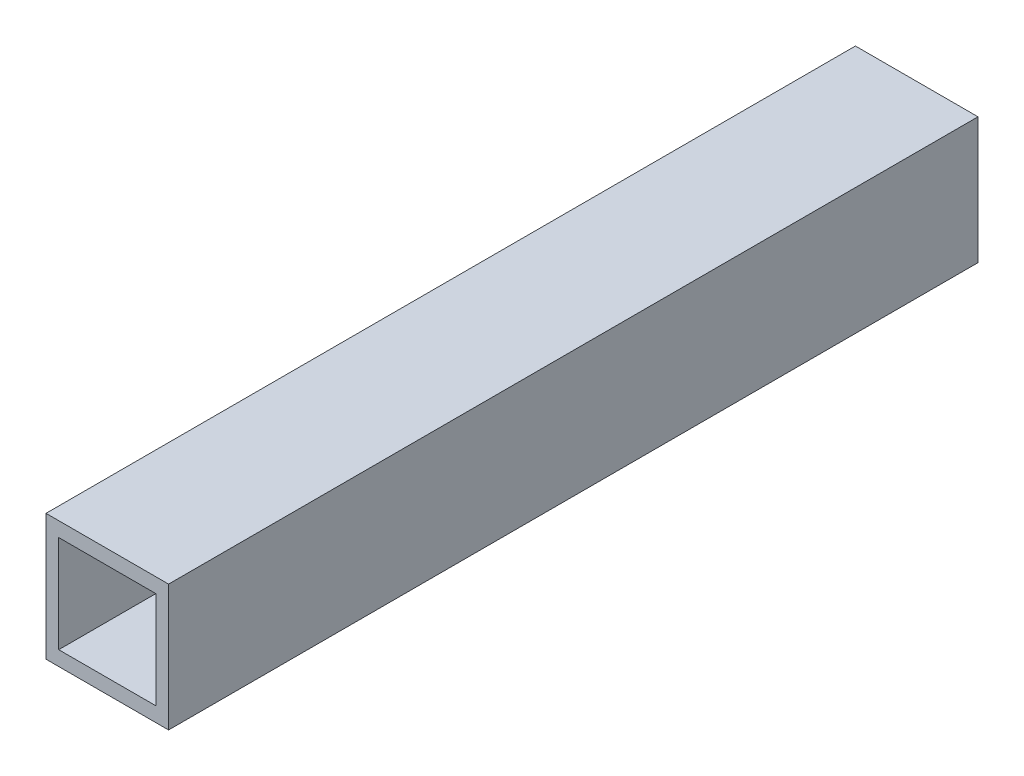
ISO-10303-21;
HEADER;
FILE_DESCRIPTION(('STEP AP214'),'2;1');
FILE_NAME('part.step','',(''),(''),'','','');
FILE_SCHEMA(('AUTOMOTIVE_DESIGN { 1 0 10303 214 1 1 1 1 }'));
ENDSEC;
DATA;
#1=APPLICATION_CONTEXT('core data for automotive mechanical design processes');
#2=APPLICATION_PROTOCOL_DEFINITION('international standard','automotive_design',2000,#1);
#3=PRODUCT_CONTEXT('',#1,'mechanical');
#4=PRODUCT('Part','Part','',(#3));
#5=PRODUCT_RELATED_PRODUCT_CATEGORY('part','',(#4));
#6=PRODUCT_DEFINITION_FORMATION('','',#4);
#7=PRODUCT_DEFINITION_CONTEXT('part definition',#1,'design');
#8=PRODUCT_DEFINITION('design','',#6,#7);
#9=PRODUCT_DEFINITION_SHAPE('','',#8);
#10=(LENGTH_UNIT() NAMED_UNIT(*) SI_UNIT(.MILLI.,.METRE.));
#11=(NAMED_UNIT(*) PLANE_ANGLE_UNIT() SI_UNIT($,.RADIAN.));
#12=(NAMED_UNIT(*) SI_UNIT($,.STERADIAN.) SOLID_ANGLE_UNIT());
#13=UNCERTAINTY_MEASURE_WITH_UNIT(LENGTH_MEASURE(1.E-05),#10,'distance_accuracy_value','');
#14=(GEOMETRIC_REPRESENTATION_CONTEXT(3) GLOBAL_UNCERTAINTY_ASSIGNED_CONTEXT((#13)) GLOBAL_UNIT_ASSIGNED_CONTEXT((#10,
#11,#12)) REPRESENTATION_CONTEXT('',''));
#15=CARTESIAN_POINT('',(0.,0.,0.));
#16=DIRECTION('',(0.,0.,1.));
#17=DIRECTION('',(1.,0.,0.));
#18=AXIS2_PLACEMENT_3D('',#15,#16,#17);
#19=CARTESIAN_POINT('',(0.,0.,63.5));
#20=DIRECTION('',(0.,0.,1.));
#21=DIRECTION('',(1.,0.,0.));
#22=AXIS2_PLACEMENT_3D('',#19,#20,#21);
#23=PLANE('',#22);
#24=DIRECTION('',(0.,1.,0.));
#25=VECTOR('',#24,1.);
#26=CARTESIAN_POINT('',(4.80846777573421,4.95609753272005,63.5));
#27=LINE('',#26,#25);
#28=CARTESIAN_POINT('',(4.80846777573421,-4.95609753272005,63.5));
#29=VERTEX_POINT('',#28);
#30=CARTESIAN_POINT('',(4.80846777573421,4.95609753272005,63.5));
#31=VERTEX_POINT('',#30);
#32=EDGE_CURVE('E185',#29,#31,#27,.T.);
#33=ORIENTED_EDGE('',*,*,#32,.T.);
#34=DIRECTION('',(-1.,0.,0.));
#35=VECTOR('',#34,1.);
#36=CARTESIAN_POINT('',(-4.80846777573421,4.95609753272005,63.5));
#37=LINE('',#36,#35);
#38=CARTESIAN_POINT('',(-4.80846777573421,4.95609753272005,63.5));
#39=VERTEX_POINT('',#38);
#40=EDGE_CURVE('E188',#31,#39,#37,.T.);
#41=ORIENTED_EDGE('',*,*,#40,.T.);
#42=DIRECTION('',(0.,-1.,0.));
#43=VECTOR('',#42,1.);
#44=CARTESIAN_POINT('',(-4.80846777573421,4.95609753272005,63.5));
#45=LINE('',#44,#43);
#46=CARTESIAN_POINT('',(-4.80846777573421,-4.95609753272005,63.5));
#47=VERTEX_POINT('',#46);
#48=EDGE_CURVE('E191',#39,#47,#45,.T.);
#49=ORIENTED_EDGE('',*,*,#48,.T.);
#50=DIRECTION('',(1.,0.,0.));
#51=VECTOR('',#50,1.);
#52=CARTESIAN_POINT('',(-4.80846777573421,-4.95609753272005,63.5));
#53=LINE('',#52,#51);
#54=EDGE_CURVE('E193',#47,#29,#53,.T.);
#55=ORIENTED_EDGE('',*,*,#54,.T.);
#56=EDGE_LOOP('',(#33,#41,#49,#55));
#57=FACE_BOUND('',#56,.T.);
#58=DIRECTION('',(-1.,0.,0.));
#59=VECTOR('',#58,1.);
#60=CARTESIAN_POINT('',(-3.81,3.81,63.5));
#61=LINE('',#60,#59);
#62=CARTESIAN_POINT('',(3.81,3.81,63.5));
#63=VERTEX_POINT('',#62);
#64=CARTESIAN_POINT('',(-3.81,3.81,63.5));
#65=VERTEX_POINT('',#64);
#66=EDGE_CURVE('E158',#63,#65,#61,.T.);
#67=ORIENTED_EDGE('',*,*,#66,.F.);
#68=DIRECTION('',(0.,1.,0.));
#69=VECTOR('',#68,1.);
#70=CARTESIAN_POINT('',(3.81,-3.81,63.5));
#71=LINE('',#70,#69);
#72=CARTESIAN_POINT('',(3.81,-3.81,63.5));
#73=VERTEX_POINT('',#72);
#74=EDGE_CURVE('E156',#73,#63,#71,.T.);
#75=ORIENTED_EDGE('',*,*,#74,.F.);
#76=DIRECTION('',(1.,0.,0.));
#77=VECTOR('',#76,1.);
#78=CARTESIAN_POINT('',(-3.81,-3.81,63.5));
#79=LINE('',#78,#77);
#80=CARTESIAN_POINT('',(-3.81,-3.81,63.5));
#81=VERTEX_POINT('',#80);
#82=EDGE_CURVE('E163',#81,#73,#79,.T.);
#83=ORIENTED_EDGE('',*,*,#82,.F.);
#84=DIRECTION('',(0.,-1.,0.));
#85=VECTOR('',#84,1.);
#86=CARTESIAN_POINT('',(-3.81,-3.81,63.5));
#87=LINE('',#86,#85);
#88=EDGE_CURVE('E161',#65,#81,#87,.T.);
#89=ORIENTED_EDGE('',*,*,#88,.F.);
#90=EDGE_LOOP('',(#67,#75,#83,#89));
#91=FACE_BOUND('',#90,.T.);
#92=ADVANCED_FACE('F33',(#57,#91),#23,.T.);
#93=CARTESIAN_POINT('',(0.,0.,0.));
#94=DIRECTION('',(0.,0.,1.));
#95=DIRECTION('',(1.,0.,0.));
#96=AXIS2_PLACEMENT_3D('',#93,#94,#95);
#97=PLANE('',#96);
#98=DIRECTION('',(1.,0.,0.));
#99=VECTOR('',#98,1.);
#100=CARTESIAN_POINT('',(-4.80846777573421,-4.95609753272005,0.));
#101=LINE('',#100,#99);
#102=CARTESIAN_POINT('',(3.048,-4.95609753272005,0.));
#103=VERTEX_POINT('',#102);
#104=CARTESIAN_POINT('',(4.80846777573421,-4.95609753272005,0.));
#105=VERTEX_POINT('',#104);
#106=EDGE_CURVE('E202',#103,#105,#101,.T.);
#107=ORIENTED_EDGE('',*,*,#106,.F.);
#108=DIRECTION('',(0.,1.,0.));
#109=VECTOR('',#108,1.);
#110=CARTESIAN_POINT('',(3.048,-5.07999999999998,0.));
#111=LINE('',#110,#109);
#112=CARTESIAN_POINT('',(3.048,-3.81,0.));
#113=VERTEX_POINT('',#112);
#114=EDGE_CURVE('E144',#103,#113,#111,.T.);
#115=ORIENTED_EDGE('',*,*,#114,.T.);
#116=DIRECTION('',(1.,0.,0.));
#117=VECTOR('',#116,1.);
#118=CARTESIAN_POINT('',(-3.81,-3.81,0.));
#119=LINE('',#118,#117);
#120=CARTESIAN_POINT('',(3.81,-3.81,0.));
#121=VERTEX_POINT('',#120);
#122=EDGE_CURVE('E174',#113,#121,#119,.T.);
#123=ORIENTED_EDGE('',*,*,#122,.T.);
#124=DIRECTION('',(0.,1.,0.));
#125=VECTOR('',#124,1.);
#126=CARTESIAN_POINT('',(3.81,-3.81,0.));
#127=LINE('',#126,#125);
#128=CARTESIAN_POINT('',(3.81,3.81,0.));
#129=VERTEX_POINT('',#128);
#130=EDGE_CURVE('E155',#121,#129,#127,.T.);
#131=ORIENTED_EDGE('',*,*,#130,.T.);
#132=DIRECTION('',(-1.,0.,0.));
#133=VECTOR('',#132,1.);
#134=CARTESIAN_POINT('',(-3.81,3.81,0.));
#135=LINE('',#134,#133);
#136=CARTESIAN_POINT('',(-3.81,3.81,0.));
#137=VERTEX_POINT('',#136);
#138=EDGE_CURVE('E168',#129,#137,#135,.T.);
#139=ORIENTED_EDGE('',*,*,#138,.T.);
#140=DIRECTION('',(0.,-1.,0.));
#141=VECTOR('',#140,1.);
#142=CARTESIAN_POINT('',(-3.81,-3.81,0.));
#143=LINE('',#142,#141);
#144=CARTESIAN_POINT('',(-3.81,-3.81,0.));
#145=VERTEX_POINT('',#144);
#146=EDGE_CURVE('E171',#137,#145,#143,.T.);
#147=ORIENTED_EDGE('',*,*,#146,.T.);
#148=CARTESIAN_POINT('',(-3.048,-3.81,0.));
#149=VERTEX_POINT('',#148);
#150=EDGE_CURVE('E159',#145,#149,#119,.T.);
#151=ORIENTED_EDGE('',*,*,#150,.T.);
#152=DIRECTION('',(0.,1.,0.));
#153=VECTOR('',#152,1.);
#154=CARTESIAN_POINT('',(-3.048,-5.07999999999998,0.));
#155=LINE('',#154,#153);
#156=CARTESIAN_POINT('',(-3.048,-4.95609753272005,0.));
#157=VERTEX_POINT('',#156);
#158=EDGE_CURVE('E48',#157,#149,#155,.T.);
#159=ORIENTED_EDGE('',*,*,#158,.F.);
#160=CARTESIAN_POINT('',(-4.80846777573421,-4.95609753272005,0.));
#161=VERTEX_POINT('',#160);
#162=EDGE_CURVE('E189',#161,#157,#101,.T.);
#163=ORIENTED_EDGE('',*,*,#162,.F.);
#164=DIRECTION('',(0.,-1.,0.));
#165=VECTOR('',#164,1.);
#166=CARTESIAN_POINT('',(-4.80846777573421,4.95609753272005,0.));
#167=LINE('',#166,#165);
#168=CARTESIAN_POINT('',(-4.80846777573421,4.95609753272005,0.));
#169=VERTEX_POINT('',#168);
#170=EDGE_CURVE('E200',#169,#161,#167,.T.);
#171=ORIENTED_EDGE('',*,*,#170,.F.);
#172=DIRECTION('',(-1.,0.,0.));
#173=VECTOR('',#172,1.);
#174=CARTESIAN_POINT('',(-4.80846777573421,4.95609753272005,0.));
#175=LINE('',#174,#173);
#176=CARTESIAN_POINT('',(4.80846777573421,4.95609753272005,0.));
#177=VERTEX_POINT('',#176);
#178=EDGE_CURVE('E198',#177,#169,#175,.T.);
#179=ORIENTED_EDGE('',*,*,#178,.F.);
#180=DIRECTION('',(0.,1.,0.));
#181=VECTOR('',#180,1.);
#182=CARTESIAN_POINT('',(4.80846777573421,4.95609753272005,0.));
#183=LINE('',#182,#181);
#184=EDGE_CURVE('E184',#105,#177,#183,.T.);
#185=ORIENTED_EDGE('',*,*,#184,.F.);
#186=EDGE_LOOP('',(#107,#115,#123,#131,#139,#147,#151,#159,#163,#171,#179,#185));
#187=FACE_BOUND('',#186,.T.);
#188=ADVANCED_FACE('F220',(#187),#97,.F.);
#189=CARTESIAN_POINT('',(4.80846777573421,4.95609753272005,63.5));
#190=DIRECTION('',(-1.,0.,0.));
#191=DIRECTION('',(0.,0.,1.));
#192=AXIS2_PLACEMENT_3D('',#189,#190,#191);
#193=PLANE('',#192);
#194=ORIENTED_EDGE('',*,*,#184,.T.);
#195=DIRECTION('',(0.,0.,-1.));
#196=VECTOR('',#195,1.);
#197=CARTESIAN_POINT('',(4.80846777573421,4.95609753272005,63.5));
#198=LINE('',#197,#196);
#199=EDGE_CURVE('E11',#31,#177,#198,.T.);
#200=ORIENTED_EDGE('',*,*,#199,.F.);
#201=ORIENTED_EDGE('',*,*,#32,.F.);
#202=DIRECTION('',(0.,0.,-1.));
#203=VECTOR('',#202,1.);
#204=CARTESIAN_POINT('',(4.80846777573421,-4.95609753272005,63.5));
#205=LINE('',#204,#203);
#206=EDGE_CURVE('E195',#29,#105,#205,.T.);
#207=ORIENTED_EDGE('',*,*,#206,.T.);
#208=EDGE_LOOP('',(#194,#200,#201,#207));
#209=FACE_BOUND('',#208,.T.);
#210=ADVANCED_FACE('F35',(#209),#193,.F.);
#211=CARTESIAN_POINT('',(-4.80846777573421,4.95609753272005,63.5));
#212=DIRECTION('',(0.,-1.,0.));
#213=DIRECTION('',(0.,0.,-1.));
#214=AXIS2_PLACEMENT_3D('',#211,#212,#213);
#215=PLANE('',#214);
#216=ORIENTED_EDGE('',*,*,#178,.T.);
#217=DIRECTION('',(0.,0.,-1.));
#218=VECTOR('',#217,1.);
#219=CARTESIAN_POINT('',(-4.80846777573421,4.95609753272005,63.5));
#220=LINE('',#219,#218);
#221=EDGE_CURVE('E41',#39,#169,#220,.T.);
#222=ORIENTED_EDGE('',*,*,#221,.F.);
#223=ORIENTED_EDGE('',*,*,#40,.F.);
#224=ORIENTED_EDGE('',*,*,#199,.T.);
#225=EDGE_LOOP('',(#216,#222,#223,#224));
#226=FACE_BOUND('',#225,.T.);
#227=ADVANCED_FACE('F230',(#226),#215,.F.);
#228=CARTESIAN_POINT('',(-4.80846777573421,4.95609753272005,63.5));
#229=DIRECTION('',(1.,0.,0.));
#230=DIRECTION('',(0.,0.,-1.));
#231=AXIS2_PLACEMENT_3D('',#228,#229,#230);
#232=PLANE('',#231);
#233=ORIENTED_EDGE('',*,*,#170,.T.);
#234=DIRECTION('',(0.,0.,-1.));
#235=VECTOR('',#234,1.);
#236=CARTESIAN_POINT('',(-4.80846777573421,-4.95609753272005,63.5));
#237=LINE('',#236,#235);
#238=EDGE_CURVE('E207',#47,#161,#237,.T.);
#239=ORIENTED_EDGE('',*,*,#238,.F.);
#240=ORIENTED_EDGE('',*,*,#48,.F.);
#241=ORIENTED_EDGE('',*,*,#221,.T.);
#242=EDGE_LOOP('',(#233,#239,#240,#241));
#243=FACE_BOUND('',#242,.T.);
#244=ADVANCED_FACE('F214',(#243),#232,.F.);
#245=CARTESIAN_POINT('',(-4.80846777573421,-4.95609753272005,63.5));
#246=DIRECTION('',(0.,1.,0.));
#247=DIRECTION('',(0.,0.,1.));
#248=AXIS2_PLACEMENT_3D('',#245,#246,#247);
#249=PLANE('',#248);
#250=DIRECTION('',(1.,0.,0.));
#251=VECTOR('',#250,1.);
#252=CARTESIAN_POINT('',(-4.80846777573421,-4.95609753272005,1.27));
#253=LINE('',#252,#251);
#254=CARTESIAN_POINT('',(-3.048,-4.95609753272005,1.27));
#255=VERTEX_POINT('',#254);
#256=CARTESIAN_POINT('',(3.048,-4.95609753272005,1.27));
#257=VERTEX_POINT('',#256);
#258=EDGE_CURVE('E130',#255,#257,#253,.T.);
#259=ORIENTED_EDGE('',*,*,#258,.T.);
#260=DIRECTION('',(0.,0.,-1.));
#261=VECTOR('',#260,1.);
#262=CARTESIAN_POINT('',(3.048,-4.95609753272005,63.5));
#263=LINE('',#262,#261);
#264=EDGE_CURVE('E152',#257,#103,#263,.T.);
#265=ORIENTED_EDGE('',*,*,#264,.T.);
#266=ORIENTED_EDGE('',*,*,#106,.T.);
#267=ORIENTED_EDGE('',*,*,#206,.F.);
#268=ORIENTED_EDGE('',*,*,#54,.F.);
#269=ORIENTED_EDGE('',*,*,#238,.T.);
#270=ORIENTED_EDGE('',*,*,#162,.T.);
#271=DIRECTION('',(0.,0.,1.));
#272=VECTOR('',#271,1.);
#273=CARTESIAN_POINT('',(-3.048,-4.95609753272005,63.5));
#274=LINE('',#273,#272);
#275=EDGE_CURVE('E147',#157,#255,#274,.T.);
#276=ORIENTED_EDGE('',*,*,#275,.T.);
#277=EDGE_LOOP('',(#259,#265,#266,#267,#268,#269,#270,#276));
#278=FACE_BOUND('',#277,.T.);
#279=ADVANCED_FACE('F223',(#278),#249,.F.);
#280=CARTESIAN_POINT('',(3.81,-3.81,63.5));
#281=DIRECTION('',(-1.,0.,0.));
#282=DIRECTION('',(0.,0.,1.));
#283=AXIS2_PLACEMENT_3D('',#280,#281,#282);
#284=PLANE('',#283);
#285=ORIENTED_EDGE('',*,*,#130,.F.);
#286=DIRECTION('',(0.,0.,-1.));
#287=VECTOR('',#286,1.);
#288=CARTESIAN_POINT('',(3.81,-3.81,63.5));
#289=LINE('',#288,#287);
#290=EDGE_CURVE('E165',#73,#121,#289,.T.);
#291=ORIENTED_EDGE('',*,*,#290,.F.);
#292=ORIENTED_EDGE('',*,*,#74,.T.);
#293=DIRECTION('',(0.,0.,-1.));
#294=VECTOR('',#293,1.);
#295=CARTESIAN_POINT('',(3.81,3.81,63.5));
#296=LINE('',#295,#294);
#297=EDGE_CURVE('E181',#63,#129,#296,.T.);
#298=ORIENTED_EDGE('',*,*,#297,.T.);
#299=EDGE_LOOP('',(#285,#291,#292,#298));
#300=FACE_BOUND('',#299,.T.);
#301=ADVANCED_FACE('F250',(#300),#284,.T.);
#302=CARTESIAN_POINT('',(-3.81,3.81,63.5));
#303=DIRECTION('',(0.,-1.,0.));
#304=DIRECTION('',(0.,0.,-1.));
#305=AXIS2_PLACEMENT_3D('',#302,#303,#304);
#306=PLANE('',#305);
#307=ORIENTED_EDGE('',*,*,#138,.F.);
#308=ORIENTED_EDGE('',*,*,#297,.F.);
#309=ORIENTED_EDGE('',*,*,#66,.T.);
#310=DIRECTION('',(0.,0.,-1.));
#311=VECTOR('',#310,1.);
#312=CARTESIAN_POINT('',(-3.81,3.81,63.5));
#313=LINE('',#312,#311);
#314=EDGE_CURVE('E179',#65,#137,#313,.T.);
#315=ORIENTED_EDGE('',*,*,#314,.T.);
#316=EDGE_LOOP('',(#307,#308,#309,#315));
#317=FACE_BOUND('',#316,.T.);
#318=ADVANCED_FACE('F310',(#317),#306,.T.);
#319=CARTESIAN_POINT('',(-3.81,-3.81,63.5));
#320=DIRECTION('',(1.,0.,0.));
#321=DIRECTION('',(0.,0.,-1.));
#322=AXIS2_PLACEMENT_3D('',#319,#320,#321);
#323=PLANE('',#322);
#324=ORIENTED_EDGE('',*,*,#146,.F.);
#325=ORIENTED_EDGE('',*,*,#314,.F.);
#326=ORIENTED_EDGE('',*,*,#88,.T.);
#327=DIRECTION('',(0.,0.,-1.));
#328=VECTOR('',#327,1.);
#329=CARTESIAN_POINT('',(-3.81,-3.81,63.5));
#330=LINE('',#329,#328);
#331=EDGE_CURVE('E56',#81,#145,#330,.T.);
#332=ORIENTED_EDGE('',*,*,#331,.T.);
#333=EDGE_LOOP('',(#324,#325,#326,#332));
#334=FACE_BOUND('',#333,.T.);
#335=ADVANCED_FACE('F241',(#334),#323,.T.);
#336=CARTESIAN_POINT('',(-3.81,-3.81,63.5));
#337=DIRECTION('',(0.,1.,0.));
#338=DIRECTION('',(0.,0.,1.));
#339=AXIS2_PLACEMENT_3D('',#336,#337,#338);
#340=PLANE('',#339);
#341=DIRECTION('',(0.,0.,-1.));
#342=VECTOR('',#341,1.);
#343=CARTESIAN_POINT('',(3.048,-3.81,0.));
#344=LINE('',#343,#342);
#345=CARTESIAN_POINT('',(3.048,-3.81,1.27));
#346=VERTEX_POINT('',#345);
#347=EDGE_CURVE('E140',#346,#113,#344,.T.);
#348=ORIENTED_EDGE('',*,*,#347,.F.);
#349=DIRECTION('',(1.,0.,0.));
#350=VECTOR('',#349,1.);
#351=CARTESIAN_POINT('',(3.048,-3.81,1.27));
#352=LINE('',#351,#350);
#353=CARTESIAN_POINT('',(-3.048,-3.81,1.27));
#354=VERTEX_POINT('',#353);
#355=EDGE_CURVE('E127',#354,#346,#352,.T.);
#356=ORIENTED_EDGE('',*,*,#355,.F.);
#357=DIRECTION('',(0.,0.,1.));
#358=VECTOR('',#357,1.);
#359=CARTESIAN_POINT('',(-3.048,-3.81,1.27));
#360=LINE('',#359,#358);
#361=EDGE_CURVE('E134',#149,#354,#360,.T.);
#362=ORIENTED_EDGE('',*,*,#361,.F.);
#363=ORIENTED_EDGE('',*,*,#150,.F.);
#364=ORIENTED_EDGE('',*,*,#331,.F.);
#365=ORIENTED_EDGE('',*,*,#82,.T.);
#366=ORIENTED_EDGE('',*,*,#290,.T.);
#367=ORIENTED_EDGE('',*,*,#122,.F.);
#368=EDGE_LOOP('',(#348,#356,#362,#363,#364,#365,#366,#367));
#369=FACE_BOUND('',#368,.T.);
#370=ADVANCED_FACE('F138',(#369),#340,.T.);
#371=CARTESIAN_POINT('',(3.048,-5.07999999999998,0.));
#372=DIRECTION('',(1.,0.,0.));
#373=DIRECTION('',(0.,0.,-1.));
#374=AXIS2_PLACEMENT_3D('',#371,#372,#373);
#375=PLANE('',#374);
#376=DIRECTION('',(0.,1.,0.));
#377=VECTOR('',#376,1.);
#378=CARTESIAN_POINT('',(3.048,-5.07999999999998,1.27));
#379=LINE('',#378,#377);
#380=EDGE_CURVE('E132',#257,#346,#379,.T.);
#381=ORIENTED_EDGE('',*,*,#380,.T.);
#382=ORIENTED_EDGE('',*,*,#347,.T.);
#383=ORIENTED_EDGE('',*,*,#114,.F.);
#384=ORIENTED_EDGE('',*,*,#264,.F.);
#385=EDGE_LOOP('',(#381,#382,#383,#384));
#386=FACE_BOUND('',#385,.T.);
#387=ADVANCED_FACE('F233',(#386),#375,.F.);
#388=CARTESIAN_POINT('',(3.048,-5.07999999999998,1.27));
#389=DIRECTION('',(0.,0.,1.));
#390=DIRECTION('',(1.,0.,0.));
#391=AXIS2_PLACEMENT_3D('',#388,#389,#390);
#392=PLANE('',#391);
#393=DIRECTION('',(0.,1.,0.));
#394=VECTOR('',#393,1.);
#395=CARTESIAN_POINT('',(-3.048,-5.07999999999998,1.27));
#396=LINE('',#395,#394);
#397=EDGE_CURVE('E123',#255,#354,#396,.T.);
#398=ORIENTED_EDGE('',*,*,#397,.T.);
#399=ORIENTED_EDGE('',*,*,#355,.T.);
#400=ORIENTED_EDGE('',*,*,#380,.F.);
#401=ORIENTED_EDGE('',*,*,#258,.F.);
#402=EDGE_LOOP('',(#398,#399,#400,#401));
#403=FACE_BOUND('',#402,.T.);
#404=ADVANCED_FACE('F124',(#403),#392,.F.);
#405=CARTESIAN_POINT('',(-3.048,-5.07999999999998,1.27));
#406=DIRECTION('',(-1.,0.,0.));
#407=DIRECTION('',(0.,0.,1.));
#408=AXIS2_PLACEMENT_3D('',#405,#406,#407);
#409=PLANE('',#408);
#410=ORIENTED_EDGE('',*,*,#158,.T.);
#411=ORIENTED_EDGE('',*,*,#361,.T.);
#412=ORIENTED_EDGE('',*,*,#397,.F.);
#413=ORIENTED_EDGE('',*,*,#275,.F.);
#414=EDGE_LOOP('',(#410,#411,#412,#413));
#415=FACE_BOUND('',#414,.T.);
#416=ADVANCED_FACE('F135',(#415),#409,.F.);
#417=CLOSED_SHELL('',(#92,#188,#210,#227,#244,#279,#301,#318,#335,#370,#387,#404,#416));
#418=MANIFOLD_SOLID_BREP('B2',#417);
#419=ADVANCED_BREP_SHAPE_REPRESENTATION('',(#18,#418),#14);
#420=SHAPE_DEFINITION_REPRESENTATION(#9,#419);
ENDSEC;
END-ISO-10303-21;
